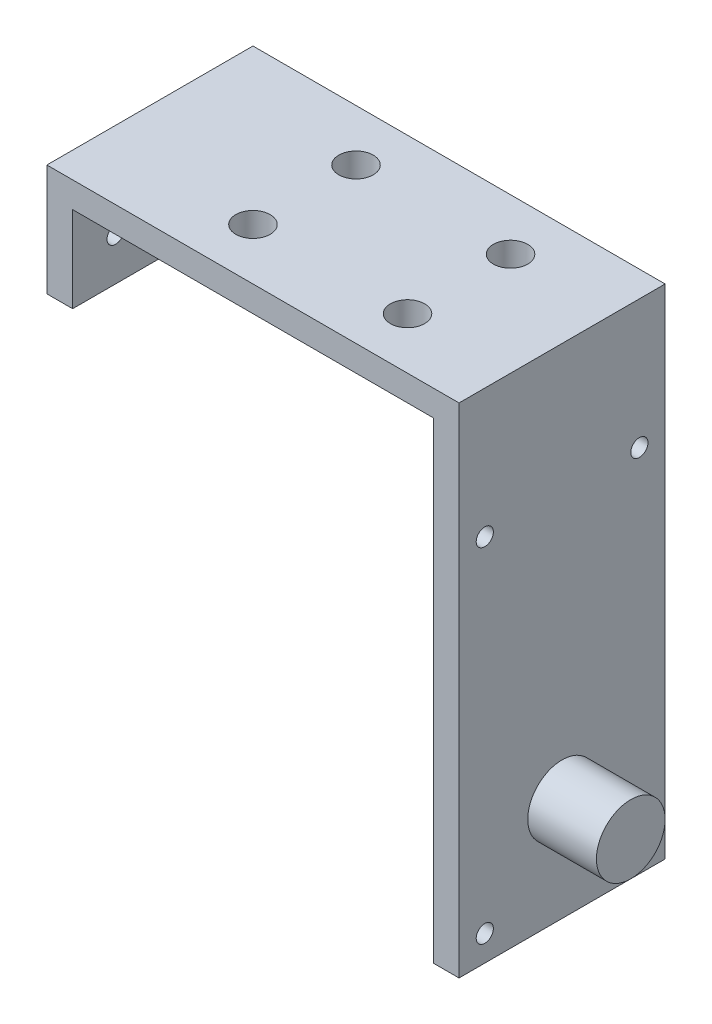
ISO-10303-21;
HEADER;
FILE_DESCRIPTION(('STEP AP214'),'2;1');
FILE_NAME('part.step','',(''),(''),'','','');
FILE_SCHEMA(('AUTOMOTIVE_DESIGN { 1 0 10303 214 1 1 1 1 }'));
ENDSEC;
DATA;
#1=APPLICATION_CONTEXT('core data for automotive mechanical design processes');
#2=APPLICATION_PROTOCOL_DEFINITION('international standard','automotive_design',2000,#1);
#3=PRODUCT_CONTEXT('',#1,'mechanical');
#4=PRODUCT('Part','Part','',(#3));
#5=PRODUCT_RELATED_PRODUCT_CATEGORY('part','',(#4));
#6=PRODUCT_DEFINITION_FORMATION('','',#4);
#7=PRODUCT_DEFINITION_CONTEXT('part definition',#1,'design');
#8=PRODUCT_DEFINITION('design','',#6,#7);
#9=PRODUCT_DEFINITION_SHAPE('','',#8);
#10=(LENGTH_UNIT() NAMED_UNIT(*) SI_UNIT(.MILLI.,.METRE.));
#11=(NAMED_UNIT(*) PLANE_ANGLE_UNIT() SI_UNIT($,.RADIAN.));
#12=(NAMED_UNIT(*) SI_UNIT($,.STERADIAN.) SOLID_ANGLE_UNIT());
#13=UNCERTAINTY_MEASURE_WITH_UNIT(LENGTH_MEASURE(1.E-05),#10,'distance_accuracy_value','');
#14=(GEOMETRIC_REPRESENTATION_CONTEXT(3) GLOBAL_UNCERTAINTY_ASSIGNED_CONTEXT((#13)) GLOBAL_UNIT_ASSIGNED_CONTEXT((#10,
#11,#12)) REPRESENTATION_CONTEXT('',''));
#15=CARTESIAN_POINT('',(0.,0.,0.));
#16=DIRECTION('',(0.,0.,1.));
#17=DIRECTION('',(1.,0.,0.));
#18=AXIS2_PLACEMENT_3D('',#15,#16,#17);
#19=CARTESIAN_POINT('',(0.,0.,12.));
#20=DIRECTION('',(0.,0.,1.));
#21=DIRECTION('',(1.,0.,0.));
#22=AXIS2_PLACEMENT_3D('',#19,#20,#21);
#23=PLANE('',#22);
#24=DIRECTION('',(-1.,0.,0.));
#25=VECTOR('',#24,1.);
#26=CARTESIAN_POINT('',(0.,8.00000000000001,12.));
#27=LINE('',#26,#25);
#28=CARTESIAN_POINT('',(-10.5,8.00000000000001,12.));
#29=VERTEX_POINT('',#28);
#30=CARTESIAN_POINT('',(-12.,8.00000000000001,12.));
#31=VERTEX_POINT('',#30);
#32=EDGE_CURVE('E97',#29,#31,#27,.T.);
#33=ORIENTED_EDGE('',*,*,#32,.F.);
#34=DIRECTION('',(0.,-1.,0.));
#35=VECTOR('',#34,1.);
#36=CARTESIAN_POINT('',(-10.5,13.,12.));
#37=LINE('',#36,#35);
#38=CARTESIAN_POINT('',(-10.5,13.,12.));
#39=VERTEX_POINT('',#38);
#40=EDGE_CURVE('E208',#39,#29,#37,.T.);
#41=ORIENTED_EDGE('',*,*,#40,.F.);
#42=DIRECTION('',(-1.,0.,0.));
#43=VECTOR('',#42,1.);
#44=CARTESIAN_POINT('',(-10.5,13.,12.));
#45=LINE('',#44,#43);
#46=CARTESIAN_POINT('',(10.5,13.,12.));
#47=VERTEX_POINT('',#46);
#48=EDGE_CURVE('E213',#47,#39,#45,.T.);
#49=ORIENTED_EDGE('',*,*,#48,.F.);
#50=DIRECTION('',(0.,1.,0.));
#51=VECTOR('',#50,1.);
#52=CARTESIAN_POINT('',(10.5,13.,12.));
#53=LINE('',#52,#51);
#54=CARTESIAN_POINT('',(10.5,-14.5,12.));
#55=VERTEX_POINT('',#54);
#56=EDGE_CURVE('E210',#55,#47,#53,.T.);
#57=ORIENTED_EDGE('',*,*,#56,.F.);
#58=DIRECTION('',(1.,0.,0.));
#59=VECTOR('',#58,1.);
#60=CARTESIAN_POINT('',(-12.,-14.5,12.));
#61=LINE('',#60,#59);
#62=CARTESIAN_POINT('',(12.,-14.5,12.));
#63=VERTEX_POINT('',#62);
#64=EDGE_CURVE('E119',#55,#63,#61,.T.);
#65=ORIENTED_EDGE('',*,*,#64,.T.);
#66=DIRECTION('',(0.,1.,0.));
#67=VECTOR('',#66,1.);
#68=CARTESIAN_POINT('',(12.,14.5,12.));
#69=LINE('',#68,#67);
#70=CARTESIAN_POINT('',(12.,14.5,12.));
#71=VERTEX_POINT('',#70);
#72=EDGE_CURVE('E123',#63,#71,#69,.T.);
#73=ORIENTED_EDGE('',*,*,#72,.T.);
#74=DIRECTION('',(-1.,0.,0.));
#75=VECTOR('',#74,1.);
#76=CARTESIAN_POINT('',(-12.,14.5,12.));
#77=LINE('',#76,#75);
#78=CARTESIAN_POINT('',(-12.,14.5,12.));
#79=VERTEX_POINT('',#78);
#80=EDGE_CURVE('E117',#71,#79,#77,.T.);
#81=ORIENTED_EDGE('',*,*,#80,.T.);
#82=DIRECTION('',(0.,-1.,0.));
#83=VECTOR('',#82,1.);
#84=CARTESIAN_POINT('',(-12.,14.5,12.));
#85=LINE('',#84,#83);
#86=EDGE_CURVE('E111',#79,#31,#85,.T.);
#87=ORIENTED_EDGE('',*,*,#86,.T.);
#88=EDGE_LOOP('',(#33,#41,#49,#57,#65,#73,#81,#87));
#89=FACE_BOUND('',#88,.T.);
#90=ADVANCED_FACE('F32',(#89),#23,.T.);
#91=CARTESIAN_POINT('',(0.,0.,0.));
#92=DIRECTION('',(0.,0.,1.));
#93=DIRECTION('',(1.,0.,0.));
#94=AXIS2_PLACEMENT_3D('',#91,#92,#93);
#95=PLANE('',#94);
#96=DIRECTION('',(0.,-1.,0.));
#97=VECTOR('',#96,1.);
#98=CARTESIAN_POINT('',(-10.5,13.,0.));
#99=LINE('',#98,#97);
#100=CARTESIAN_POINT('',(-10.5,13.,0.));
#101=VERTEX_POINT('',#100);
#102=CARTESIAN_POINT('',(-10.5,8.00000000000001,0.));
#103=VERTEX_POINT('',#102);
#104=EDGE_CURVE('E207',#101,#103,#99,.T.);
#105=ORIENTED_EDGE('',*,*,#104,.T.);
#106=DIRECTION('',(-1.,0.,0.));
#107=VECTOR('',#106,1.);
#108=CARTESIAN_POINT('',(0.,8.00000000000001,0.));
#109=LINE('',#108,#107);
#110=CARTESIAN_POINT('',(-12.,8.00000000000001,0.));
#111=VERTEX_POINT('',#110);
#112=EDGE_CURVE('E49',#103,#111,#109,.T.);
#113=ORIENTED_EDGE('',*,*,#112,.T.);
#114=DIRECTION('',(0.,-1.,0.));
#115=VECTOR('',#114,1.);
#116=CARTESIAN_POINT('',(-12.,14.5,0.));
#117=LINE('',#116,#115);
#118=CARTESIAN_POINT('',(-12.,14.5,0.));
#119=VERTEX_POINT('',#118);
#120=EDGE_CURVE('E113',#119,#111,#117,.T.);
#121=ORIENTED_EDGE('',*,*,#120,.F.);
#122=DIRECTION('',(-1.,0.,0.));
#123=VECTOR('',#122,1.);
#124=CARTESIAN_POINT('',(-12.,14.5,0.));
#125=LINE('',#124,#123);
#126=CARTESIAN_POINT('',(12.,14.5,0.));
#127=VERTEX_POINT('',#126);
#128=EDGE_CURVE('E130',#127,#119,#125,.T.);
#129=ORIENTED_EDGE('',*,*,#128,.F.);
#130=DIRECTION('',(0.,1.,0.));
#131=VECTOR('',#130,1.);
#132=CARTESIAN_POINT('',(12.,14.5,0.));
#133=LINE('',#132,#131);
#134=CARTESIAN_POINT('',(12.,-14.5,0.));
#135=VERTEX_POINT('',#134);
#136=EDGE_CURVE('E127',#135,#127,#133,.T.);
#137=ORIENTED_EDGE('',*,*,#136,.F.);
#138=DIRECTION('',(1.,0.,0.));
#139=VECTOR('',#138,1.);
#140=CARTESIAN_POINT('',(-12.,-14.5,0.));
#141=LINE('',#140,#139);
#142=CARTESIAN_POINT('',(10.5,-14.5,0.));
#143=VERTEX_POINT('',#142);
#144=EDGE_CURVE('E133',#143,#135,#141,.T.);
#145=ORIENTED_EDGE('',*,*,#144,.F.);
#146=DIRECTION('',(0.,1.,0.));
#147=VECTOR('',#146,1.);
#148=CARTESIAN_POINT('',(10.5,13.,0.));
#149=LINE('',#148,#147);
#150=CARTESIAN_POINT('',(10.5,13.,0.));
#151=VERTEX_POINT('',#150);
#152=EDGE_CURVE('E218',#143,#151,#149,.T.);
#153=ORIENTED_EDGE('',*,*,#152,.T.);
#154=DIRECTION('',(-1.,0.,0.));
#155=VECTOR('',#154,1.);
#156=CARTESIAN_POINT('',(-10.5,13.,0.));
#157=LINE('',#156,#155);
#158=EDGE_CURVE('E211',#151,#101,#157,.T.);
#159=ORIENTED_EDGE('',*,*,#158,.T.);
#160=EDGE_LOOP('',(#105,#113,#121,#129,#137,#145,#153,#159));
#161=FACE_BOUND('',#160,.T.);
#162=ADVANCED_FACE('F234',(#161),#95,.F.);
#163=CARTESIAN_POINT('',(12.,14.5,12.));
#164=DIRECTION('',(-1.,0.,0.));
#165=DIRECTION('',(0.,-1.,0.));
#166=AXIS2_PLACEMENT_3D('',#163,#164,#165);
#167=PLANE('',#166);
#168=CARTESIAN_POINT('',(12.,-8.5,6.));
#169=DIRECTION('',(-1.,0.,0.));
#170=DIRECTION('',(0.,-1.,0.));
#171=AXIS2_PLACEMENT_3D('',#168,#169,#170);
#172=CIRCLE('',#171,2.);
#173=CARTESIAN_POINT('',(12.,-10.5,6.));
#174=VERTEX_POINT('',#173);
#175=EDGE_CURVE('E11',#174,#174,#172,.F.);
#176=ORIENTED_EDGE('',*,*,#175,.F.);
#177=EDGE_LOOP('',(#176));
#178=FACE_BOUND('',#177,.T.);
#179=CARTESIAN_POINT('',(12.,-13.,1.5));
#180=DIRECTION('',(1.,0.,0.));
#181=DIRECTION('',(0.,-1.,0.));
#182=AXIS2_PLACEMENT_3D('',#179,#180,#181);
#183=CIRCLE('',#182,0.500000000000001);
#184=CARTESIAN_POINT('',(12.,-13.5,1.5));
#185=VERTEX_POINT('',#184);
#186=EDGE_CURVE('E150',#185,#185,#183,.T.);
#187=ORIENTED_EDGE('',*,*,#186,.F.);
#188=EDGE_LOOP('',(#187));
#189=FACE_BOUND('',#188,.T.);
#190=CARTESIAN_POINT('',(12.,7.,10.5));
#191=DIRECTION('',(1.,0.,0.));
#192=DIRECTION('',(0.,1.,0.));
#193=AXIS2_PLACEMENT_3D('',#190,#191,#192);
#194=CIRCLE('',#193,0.500000000000001);
#195=CARTESIAN_POINT('',(12.,7.5,10.5));
#196=VERTEX_POINT('',#195);
#197=EDGE_CURVE('E196',#196,#196,#194,.T.);
#198=ORIENTED_EDGE('',*,*,#197,.F.);
#199=EDGE_LOOP('',(#198));
#200=FACE_BOUND('',#199,.T.);
#201=CARTESIAN_POINT('',(12.,7.,1.5));
#202=DIRECTION('',(1.,0.,0.));
#203=DIRECTION('',(0.,-1.,0.));
#204=AXIS2_PLACEMENT_3D('',#201,#202,#203);
#205=CIRCLE('',#204,0.500000000000001);
#206=CARTESIAN_POINT('',(12.,6.5,1.5));
#207=VERTEX_POINT('',#206);
#208=EDGE_CURVE('E159',#207,#207,#205,.T.);
#209=ORIENTED_EDGE('',*,*,#208,.F.);
#210=EDGE_LOOP('',(#209));
#211=FACE_BOUND('',#210,.T.);
#212=CARTESIAN_POINT('',(12.,-13.,10.5));
#213=DIRECTION('',(1.,0.,0.));
#214=DIRECTION('',(0.,1.,0.));
#215=AXIS2_PLACEMENT_3D('',#212,#213,#214);
#216=CIRCLE('',#215,0.500000000000001);
#217=CARTESIAN_POINT('',(12.,-12.5,10.5));
#218=VERTEX_POINT('',#217);
#219=EDGE_CURVE('E145',#218,#218,#216,.T.);
#220=ORIENTED_EDGE('',*,*,#219,.F.);
#221=EDGE_LOOP('',(#220));
#222=FACE_BOUND('',#221,.T.);
#223=ORIENTED_EDGE('',*,*,#136,.T.);
#224=DIRECTION('',(0.,0.,-1.));
#225=VECTOR('',#224,1.);
#226=CARTESIAN_POINT('',(12.,14.5,12.));
#227=LINE('',#226,#225);
#228=EDGE_CURVE('E139',#71,#127,#227,.T.);
#229=ORIENTED_EDGE('',*,*,#228,.F.);
#230=ORIENTED_EDGE('',*,*,#72,.F.);
#231=DIRECTION('',(0.,0.,-1.));
#232=VECTOR('',#231,1.);
#233=CARTESIAN_POINT('',(12.,-14.5,12.));
#234=LINE('',#233,#232);
#235=EDGE_CURVE('E121',#63,#135,#234,.T.);
#236=ORIENTED_EDGE('',*,*,#235,.T.);
#237=EDGE_LOOP('',(#223,#229,#230,#236));
#238=FACE_BOUND('',#237,.T.);
#239=ADVANCED_FACE('F34',(#178,#189,#200,#211,#222,#238),#167,.F.);
#240=CARTESIAN_POINT('',(-12.,14.5,12.));
#241=DIRECTION('',(0.,-1.,0.));
#242=DIRECTION('',(0.,0.,-1.));
#243=AXIS2_PLACEMENT_3D('',#240,#241,#242);
#244=PLANE('',#243);
#245=CARTESIAN_POINT('',(6.,14.5,9.));
#246=DIRECTION('',(0.,1.,0.));
#247=DIRECTION('',(0.,0.,-1.));
#248=AXIS2_PLACEMENT_3D('',#245,#246,#247);
#249=CIRCLE('',#248,0.999999999999999);
#250=CARTESIAN_POINT('',(6.,14.5,8.));
#251=VERTEX_POINT('',#250);
#252=EDGE_CURVE('E173',#251,#251,#249,.T.);
#253=ORIENTED_EDGE('',*,*,#252,.F.);
#254=EDGE_LOOP('',(#253));
#255=FACE_BOUND('',#254,.T.);
#256=CARTESIAN_POINT('',(-3.,14.5,3.));
#257=DIRECTION('',(0.,1.,0.));
#258=DIRECTION('',(0.,0.,1.));
#259=AXIS2_PLACEMENT_3D('',#256,#257,#258);
#260=CIRCLE('',#259,1.);
#261=CARTESIAN_POINT('',(-3.,14.5,4.));
#262=VERTEX_POINT('',#261);
#263=EDGE_CURVE('E322',#262,#262,#260,.T.);
#264=ORIENTED_EDGE('',*,*,#263,.F.);
#265=EDGE_LOOP('',(#264));
#266=FACE_BOUND('',#265,.T.);
#267=CARTESIAN_POINT('',(-3.,14.5,9.));
#268=DIRECTION('',(0.,1.,0.));
#269=DIRECTION('',(0.,0.,-1.));
#270=AXIS2_PLACEMENT_3D('',#267,#268,#269);
#271=CIRCLE('',#270,0.999999999999999);
#272=CARTESIAN_POINT('',(-3.,14.5,8.));
#273=VERTEX_POINT('',#272);
#274=EDGE_CURVE('E186',#273,#273,#271,.T.);
#275=ORIENTED_EDGE('',*,*,#274,.F.);
#276=EDGE_LOOP('',(#275));
#277=FACE_BOUND('',#276,.T.);
#278=CARTESIAN_POINT('',(6.,14.5,3.));
#279=DIRECTION('',(0.,1.,0.));
#280=DIRECTION('',(0.,0.,1.));
#281=AXIS2_PLACEMENT_3D('',#278,#279,#280);
#282=CIRCLE('',#281,1.);
#283=CARTESIAN_POINT('',(6.,14.5,4.));
#284=VERTEX_POINT('',#283);
#285=EDGE_CURVE('E169',#284,#284,#282,.T.);
#286=ORIENTED_EDGE('',*,*,#285,.F.);
#287=EDGE_LOOP('',(#286));
#288=FACE_BOUND('',#287,.T.);
#289=ORIENTED_EDGE('',*,*,#128,.T.);
#290=DIRECTION('',(0.,0.,-1.));
#291=VECTOR('',#290,1.);
#292=CARTESIAN_POINT('',(-12.,14.5,12.));
#293=LINE('',#292,#291);
#294=EDGE_CURVE('E137',#79,#119,#293,.T.);
#295=ORIENTED_EDGE('',*,*,#294,.F.);
#296=ORIENTED_EDGE('',*,*,#80,.F.);
#297=ORIENTED_EDGE('',*,*,#228,.T.);
#298=EDGE_LOOP('',(#289,#295,#296,#297));
#299=FACE_BOUND('',#298,.T.);
#300=ADVANCED_FACE('F232',(#255,#266,#277,#288,#299),#244,.F.);
#301=CARTESIAN_POINT('',(-12.,14.5,12.));
#302=DIRECTION('',(1.,0.,0.));
#303=DIRECTION('',(0.,1.,0.));
#304=AXIS2_PLACEMENT_3D('',#301,#302,#303);
#305=PLANE('',#304);
#306=CARTESIAN_POINT('',(-12.,10.5,2.5));
#307=DIRECTION('',(-1.,0.,0.));
#308=DIRECTION('',(0.,1.,0.));
#309=AXIS2_PLACEMENT_3D('',#306,#307,#308);
#310=CIRCLE('',#309,0.500000000000001);
#311=CARTESIAN_POINT('',(-12.,11.,2.5));
#312=VERTEX_POINT('',#311);
#313=EDGE_CURVE('E163',#312,#312,#310,.T.);
#314=ORIENTED_EDGE('',*,*,#313,.F.);
#315=EDGE_LOOP('',(#314));
#316=FACE_BOUND('',#315,.T.);
#317=CARTESIAN_POINT('',(-12.,10.5,9.5));
#318=DIRECTION('',(-1.,0.,0.));
#319=DIRECTION('',(0.,-1.,0.));
#320=AXIS2_PLACEMENT_3D('',#317,#318,#319);
#321=CIRCLE('',#320,0.500000000000001);
#322=CARTESIAN_POINT('',(-12.,10.,9.5));
#323=VERTEX_POINT('',#322);
#324=EDGE_CURVE('E160',#323,#323,#321,.T.);
#325=ORIENTED_EDGE('',*,*,#324,.F.);
#326=EDGE_LOOP('',(#325));
#327=FACE_BOUND('',#326,.T.);
#328=ORIENTED_EDGE('',*,*,#120,.T.);
#329=DIRECTION('',(0.,0.,-1.));
#330=VECTOR('',#329,1.);
#331=CARTESIAN_POINT('',(-12.,8.00000000000001,0.));
#332=LINE('',#331,#330);
#333=EDGE_CURVE('E100',#31,#111,#332,.T.);
#334=ORIENTED_EDGE('',*,*,#333,.F.);
#335=ORIENTED_EDGE('',*,*,#86,.F.);
#336=ORIENTED_EDGE('',*,*,#294,.T.);
#337=EDGE_LOOP('',(#328,#334,#335,#336));
#338=FACE_BOUND('',#337,.T.);
#339=ADVANCED_FACE('F109',(#316,#327,#338),#305,.F.);
#340=CARTESIAN_POINT('',(-12.,-14.5,12.));
#341=DIRECTION('',(0.,1.,0.));
#342=DIRECTION('',(0.,0.,1.));
#343=AXIS2_PLACEMENT_3D('',#340,#341,#342);
#344=PLANE('',#343);
#345=ORIENTED_EDGE('',*,*,#64,.F.);
#346=DIRECTION('',(0.,0.,-1.));
#347=VECTOR('',#346,1.);
#348=CARTESIAN_POINT('',(10.5,-14.5,0.));
#349=LINE('',#348,#347);
#350=EDGE_CURVE('E203',#55,#143,#349,.T.);
#351=ORIENTED_EDGE('',*,*,#350,.T.);
#352=ORIENTED_EDGE('',*,*,#144,.T.);
#353=ORIENTED_EDGE('',*,*,#235,.F.);
#354=EDGE_LOOP('',(#345,#351,#352,#353));
#355=FACE_BOUND('',#354,.T.);
#356=ADVANCED_FACE('F245',(#355),#344,.F.);
#357=CARTESIAN_POINT('',(-10.5,13.,12.));
#358=DIRECTION('',(1.,0.,0.));
#359=DIRECTION('',(0.,1.,0.));
#360=AXIS2_PLACEMENT_3D('',#357,#358,#359);
#361=PLANE('',#360);
#362=CARTESIAN_POINT('',(-10.5,10.5,2.5));
#363=DIRECTION('',(1.,0.,0.));
#364=DIRECTION('',(0.,1.,0.));
#365=AXIS2_PLACEMENT_3D('',#362,#363,#364);
#366=CIRCLE('',#365,0.500000000000001);
#367=CARTESIAN_POINT('',(-10.5,11.,2.5));
#368=VERTEX_POINT('',#367);
#369=EDGE_CURVE('E161',#368,#368,#366,.T.);
#370=ORIENTED_EDGE('',*,*,#369,.F.);
#371=EDGE_LOOP('',(#370));
#372=FACE_BOUND('',#371,.T.);
#373=CARTESIAN_POINT('',(-10.5,10.5,9.5));
#374=DIRECTION('',(1.,0.,0.));
#375=DIRECTION('',(0.,1.,0.));
#376=AXIS2_PLACEMENT_3D('',#373,#374,#375);
#377=CIRCLE('',#376,0.500000000000001);
#378=CARTESIAN_POINT('',(-10.5,11.,9.5));
#379=VERTEX_POINT('',#378);
#380=EDGE_CURVE('E156',#379,#379,#377,.T.);
#381=ORIENTED_EDGE('',*,*,#380,.F.);
#382=EDGE_LOOP('',(#381));
#383=FACE_BOUND('',#382,.T.);
#384=DIRECTION('',(0.,0.,1.));
#385=VECTOR('',#384,1.);
#386=CARTESIAN_POINT('',(-10.5,8.00000000000001,12.));
#387=LINE('',#386,#385);
#388=EDGE_CURVE('E41',#103,#29,#387,.T.);
#389=ORIENTED_EDGE('',*,*,#388,.F.);
#390=ORIENTED_EDGE('',*,*,#104,.F.);
#391=DIRECTION('',(0.,0.,-1.));
#392=VECTOR('',#391,1.);
#393=CARTESIAN_POINT('',(-10.5,13.,12.));
#394=LINE('',#393,#392);
#395=EDGE_CURVE('E215',#39,#101,#394,.T.);
#396=ORIENTED_EDGE('',*,*,#395,.F.);
#397=ORIENTED_EDGE('',*,*,#40,.T.);
#398=EDGE_LOOP('',(#389,#390,#396,#397));
#399=FACE_BOUND('',#398,.T.);
#400=ADVANCED_FACE('F237',(#372,#383,#399),#361,.T.);
#401=CARTESIAN_POINT('',(10.5,13.,12.));
#402=DIRECTION('',(-1.,0.,0.));
#403=DIRECTION('',(0.,-1.,0.));
#404=AXIS2_PLACEMENT_3D('',#401,#402,#403);
#405=PLANE('',#404);
#406=CARTESIAN_POINT('',(10.5,-13.,1.5));
#407=DIRECTION('',(-1.,0.,0.));
#408=DIRECTION('',(0.,-1.,0.));
#409=AXIS2_PLACEMENT_3D('',#406,#407,#408);
#410=CIRCLE('',#409,0.500000000000001);
#411=CARTESIAN_POINT('',(10.5,-13.5,1.5));
#412=VERTEX_POINT('',#411);
#413=EDGE_CURVE('E153',#412,#412,#410,.T.);
#414=ORIENTED_EDGE('',*,*,#413,.F.);
#415=EDGE_LOOP('',(#414));
#416=FACE_BOUND('',#415,.T.);
#417=CARTESIAN_POINT('',(10.5,7.,10.5));
#418=DIRECTION('',(-1.,0.,0.));
#419=DIRECTION('',(0.,-1.,0.));
#420=AXIS2_PLACEMENT_3D('',#417,#418,#419);
#421=CIRCLE('',#420,0.500000000000001);
#422=CARTESIAN_POINT('',(10.5,6.5,10.5));
#423=VERTEX_POINT('',#422);
#424=EDGE_CURVE('E149',#423,#423,#421,.T.);
#425=ORIENTED_EDGE('',*,*,#424,.F.);
#426=EDGE_LOOP('',(#425));
#427=FACE_BOUND('',#426,.T.);
#428=CARTESIAN_POINT('',(10.5,7.,1.5));
#429=DIRECTION('',(-1.,0.,0.));
#430=DIRECTION('',(0.,-1.,0.));
#431=AXIS2_PLACEMENT_3D('',#428,#429,#430);
#432=CIRCLE('',#431,0.500000000000001);
#433=CARTESIAN_POINT('',(10.5,6.5,1.5));
#434=VERTEX_POINT('',#433);
#435=EDGE_CURVE('E146',#434,#434,#432,.T.);
#436=ORIENTED_EDGE('',*,*,#435,.F.);
#437=EDGE_LOOP('',(#436));
#438=FACE_BOUND('',#437,.T.);
#439=CARTESIAN_POINT('',(10.5,-13.,10.5));
#440=DIRECTION('',(-1.,0.,0.));
#441=DIRECTION('',(0.,-1.,0.));
#442=AXIS2_PLACEMENT_3D('',#439,#440,#441);
#443=CIRCLE('',#442,0.500000000000001);
#444=CARTESIAN_POINT('',(10.5,-13.5,10.5));
#445=VERTEX_POINT('',#444);
#446=EDGE_CURVE('E114',#445,#445,#443,.T.);
#447=ORIENTED_EDGE('',*,*,#446,.F.);
#448=EDGE_LOOP('',(#447));
#449=FACE_BOUND('',#448,.T.);
#450=ORIENTED_EDGE('',*,*,#152,.F.);
#451=ORIENTED_EDGE('',*,*,#350,.F.);
#452=ORIENTED_EDGE('',*,*,#56,.T.);
#453=DIRECTION('',(0.,0.,-1.));
#454=VECTOR('',#453,1.);
#455=CARTESIAN_POINT('',(10.5,13.,12.));
#456=LINE('',#455,#454);
#457=EDGE_CURVE('E57',#47,#151,#456,.T.);
#458=ORIENTED_EDGE('',*,*,#457,.T.);
#459=EDGE_LOOP('',(#450,#451,#452,#458));
#460=FACE_BOUND('',#459,.T.);
#461=ADVANCED_FACE('F242',(#416,#427,#438,#449,#460),#405,.T.);
#462=CARTESIAN_POINT('',(-10.5,13.,12.));
#463=DIRECTION('',(0.,-1.,0.));
#464=DIRECTION('',(0.,0.,-1.));
#465=AXIS2_PLACEMENT_3D('',#462,#463,#464);
#466=PLANE('',#465);
#467=CARTESIAN_POINT('',(6.,13.,9.));
#468=DIRECTION('',(0.,-1.,0.));
#469=DIRECTION('',(0.,0.,-1.));
#470=AXIS2_PLACEMENT_3D('',#467,#468,#469);
#471=CIRCLE('',#470,0.999999999999999);
#472=CARTESIAN_POINT('',(6.,13.,8.));
#473=VERTEX_POINT('',#472);
#474=EDGE_CURVE('E36',#473,#473,#471,.T.);
#475=ORIENTED_EDGE('',*,*,#474,.F.);
#476=EDGE_LOOP('',(#475));
#477=FACE_BOUND('',#476,.T.);
#478=CARTESIAN_POINT('',(-3.,13.,3.));
#479=DIRECTION('',(0.,-1.,0.));
#480=DIRECTION('',(0.,0.,-1.));
#481=AXIS2_PLACEMENT_3D('',#478,#479,#480);
#482=CIRCLE('',#481,1.);
#483=CARTESIAN_POINT('',(-3.,13.,2.));
#484=VERTEX_POINT('',#483);
#485=EDGE_CURVE('E172',#484,#484,#482,.T.);
#486=ORIENTED_EDGE('',*,*,#485,.F.);
#487=EDGE_LOOP('',(#486));
#488=FACE_BOUND('',#487,.T.);
#489=CARTESIAN_POINT('',(-3.,13.,9.));
#490=DIRECTION('',(0.,-1.,0.));
#491=DIRECTION('',(0.,0.,-1.));
#492=AXIS2_PLACEMENT_3D('',#489,#490,#491);
#493=CIRCLE('',#492,0.999999999999999);
#494=CARTESIAN_POINT('',(-3.,13.,8.));
#495=VERTEX_POINT('',#494);
#496=EDGE_CURVE('E170',#495,#495,#493,.T.);
#497=ORIENTED_EDGE('',*,*,#496,.F.);
#498=EDGE_LOOP('',(#497));
#499=FACE_BOUND('',#498,.T.);
#500=CARTESIAN_POINT('',(6.,13.,3.));
#501=DIRECTION('',(0.,-1.,0.));
#502=DIRECTION('',(0.,0.,-1.));
#503=AXIS2_PLACEMENT_3D('',#500,#501,#502);
#504=CIRCLE('',#503,1.);
#505=CARTESIAN_POINT('',(6.,13.,2.));
#506=VERTEX_POINT('',#505);
#507=EDGE_CURVE('E165',#506,#506,#504,.T.);
#508=ORIENTED_EDGE('',*,*,#507,.F.);
#509=EDGE_LOOP('',(#508));
#510=FACE_BOUND('',#509,.T.);
#511=ORIENTED_EDGE('',*,*,#158,.F.);
#512=ORIENTED_EDGE('',*,*,#457,.F.);
#513=ORIENTED_EDGE('',*,*,#48,.T.);
#514=ORIENTED_EDGE('',*,*,#395,.T.);
#515=EDGE_LOOP('',(#511,#512,#513,#514));
#516=FACE_BOUND('',#515,.T.);
#517=ADVANCED_FACE('F238',(#477,#488,#499,#510,#516),#466,.T.);
#518=CARTESIAN_POINT('',(0.,8.00000000000001,0.));
#519=DIRECTION('',(0.,1.,0.));
#520=DIRECTION('',(-1.,0.,0.));
#521=AXIS2_PLACEMENT_3D('',#518,#519,#520);
#522=PLANE('',#521);
#523=ORIENTED_EDGE('',*,*,#388,.T.);
#524=ORIENTED_EDGE('',*,*,#32,.T.);
#525=ORIENTED_EDGE('',*,*,#333,.T.);
#526=ORIENTED_EDGE('',*,*,#112,.F.);
#527=EDGE_LOOP('',(#523,#524,#525,#526));
#528=FACE_BOUND('',#527,.T.);
#529=ADVANCED_FACE('F99',(#528),#522,.F.);
#530=CARTESIAN_POINT('',(0.,-13.,10.5));
#531=DIRECTION('',(1.,0.,0.));
#532=DIRECTION('',(0.,1.,0.));
#533=AXIS2_PLACEMENT_3D('',#530,#531,#532);
#534=CYLINDRICAL_SURFACE('',#533,0.500000000000001);
#535=ORIENTED_EDGE('',*,*,#446,.T.);
#536=EDGE_LOOP('',(#535));
#537=FACE_BOUND('',#536,.T.);
#538=ORIENTED_EDGE('',*,*,#219,.T.);
#539=EDGE_LOOP('',(#538));
#540=FACE_BOUND('',#539,.T.);
#541=ADVANCED_FACE('F271',(#537,#540),#534,.F.);
#542=CARTESIAN_POINT('',(0.,7.,1.5));
#543=DIRECTION('',(1.,0.,0.));
#544=DIRECTION('',(0.,1.,0.));
#545=AXIS2_PLACEMENT_3D('',#542,#543,#544);
#546=CYLINDRICAL_SURFACE('',#545,0.500000000000001);
#547=ORIENTED_EDGE('',*,*,#435,.T.);
#548=EDGE_LOOP('',(#547));
#549=FACE_BOUND('',#548,.T.);
#550=ORIENTED_EDGE('',*,*,#208,.T.);
#551=EDGE_LOOP('',(#550));
#552=FACE_BOUND('',#551,.T.);
#553=ADVANCED_FACE('F274',(#549,#552),#546,.F.);
#554=CARTESIAN_POINT('',(0.,7.,10.5));
#555=DIRECTION('',(1.,0.,0.));
#556=DIRECTION('',(0.,1.,0.));
#557=AXIS2_PLACEMENT_3D('',#554,#555,#556);
#558=CYLINDRICAL_SURFACE('',#557,0.500000000000001);
#559=ORIENTED_EDGE('',*,*,#424,.T.);
#560=EDGE_LOOP('',(#559));
#561=FACE_BOUND('',#560,.T.);
#562=ORIENTED_EDGE('',*,*,#197,.T.);
#563=EDGE_LOOP('',(#562));
#564=FACE_BOUND('',#563,.T.);
#565=ADVANCED_FACE('F278',(#561,#564),#558,.F.);
#566=CARTESIAN_POINT('',(0.,-13.,1.5));
#567=DIRECTION('',(1.,0.,0.));
#568=DIRECTION('',(0.,1.,0.));
#569=AXIS2_PLACEMENT_3D('',#566,#567,#568);
#570=CYLINDRICAL_SURFACE('',#569,0.500000000000001);
#571=ORIENTED_EDGE('',*,*,#413,.T.);
#572=EDGE_LOOP('',(#571));
#573=FACE_BOUND('',#572,.T.);
#574=ORIENTED_EDGE('',*,*,#186,.T.);
#575=EDGE_LOOP('',(#574));
#576=FACE_BOUND('',#575,.T.);
#577=ADVANCED_FACE('F282',(#573,#576),#570,.F.);
#578=CARTESIAN_POINT('',(0.,10.5,9.5));
#579=DIRECTION('',(-1.,0.,0.));
#580=DIRECTION('',(0.,-1.,0.));
#581=AXIS2_PLACEMENT_3D('',#578,#579,#580);
#582=CYLINDRICAL_SURFACE('',#581,0.500000000000001);
#583=ORIENTED_EDGE('',*,*,#380,.T.);
#584=EDGE_LOOP('',(#583));
#585=FACE_BOUND('',#584,.T.);
#586=ORIENTED_EDGE('',*,*,#324,.T.);
#587=EDGE_LOOP('',(#586));
#588=FACE_BOUND('',#587,.T.);
#589=ADVANCED_FACE('F286',(#585,#588),#582,.F.);
#590=CARTESIAN_POINT('',(0.,10.5,2.5));
#591=DIRECTION('',(-1.,0.,0.));
#592=DIRECTION('',(0.,-1.,0.));
#593=AXIS2_PLACEMENT_3D('',#590,#591,#592);
#594=CYLINDRICAL_SURFACE('',#593,0.500000000000001);
#595=ORIENTED_EDGE('',*,*,#369,.T.);
#596=EDGE_LOOP('',(#595));
#597=FACE_BOUND('',#596,.T.);
#598=ORIENTED_EDGE('',*,*,#313,.T.);
#599=EDGE_LOOP('',(#598));
#600=FACE_BOUND('',#599,.T.);
#601=ADVANCED_FACE('F290',(#597,#600),#594,.F.);
#602=CARTESIAN_POINT('',(16.,-8.5,6.));
#603=DIRECTION('',(-1.,0.,0.));
#604=DIRECTION('',(0.,-1.,0.));
#605=AXIS2_PLACEMENT_3D('',#602,#603,#604);
#606=CYLINDRICAL_SURFACE('',#605,2.);
#607=CARTESIAN_POINT('',(16.,-8.5,6.));
#608=DIRECTION('',(1.,0.,0.));
#609=DIRECTION('',(0.,1.,0.));
#610=AXIS2_PLACEMENT_3D('',#607,#608,#609);
#611=CIRCLE('',#610,2.);
#612=CARTESIAN_POINT('',(16.,-6.5,6.));
#613=VERTEX_POINT('',#612);
#614=EDGE_CURVE('E168',#613,#613,#611,.T.);
#615=ORIENTED_EDGE('',*,*,#614,.F.);
#616=EDGE_LOOP('',(#615));
#617=FACE_BOUND('',#616,.T.);
#618=ORIENTED_EDGE('',*,*,#175,.T.);
#619=EDGE_LOOP('',(#618));
#620=FACE_BOUND('',#619,.T.);
#621=ADVANCED_FACE('F294',(#617,#620),#606,.T.);
#622=CARTESIAN_POINT('',(16.,-8.5,6.));
#623=DIRECTION('',(1.,0.,0.));
#624=DIRECTION('',(0.,1.,0.));
#625=AXIS2_PLACEMENT_3D('',#622,#623,#624);
#626=PLANE('',#625);
#627=ORIENTED_EDGE('',*,*,#614,.T.);
#628=EDGE_LOOP('',(#627));
#629=FACE_BOUND('',#628,.T.);
#630=ADVANCED_FACE('F298',(#629),#626,.T.);
#631=CARTESIAN_POINT('',(6.,4.5,3.));
#632=DIRECTION('',(0.,1.,0.));
#633=DIRECTION('',(0.,0.,1.));
#634=AXIS2_PLACEMENT_3D('',#631,#632,#633);
#635=CYLINDRICAL_SURFACE('',#634,1.);
#636=ORIENTED_EDGE('',*,*,#507,.T.);
#637=EDGE_LOOP('',(#636));
#638=FACE_BOUND('',#637,.T.);
#639=ORIENTED_EDGE('',*,*,#285,.T.);
#640=EDGE_LOOP('',(#639));
#641=FACE_BOUND('',#640,.T.);
#642=ADVANCED_FACE('F302',(#638,#641),#635,.F.);
#643=CARTESIAN_POINT('',(-3.,4.5,9.));
#644=DIRECTION('',(0.,1.,0.));
#645=DIRECTION('',(0.,0.,1.));
#646=AXIS2_PLACEMENT_3D('',#643,#644,#645);
#647=CYLINDRICAL_SURFACE('',#646,0.999999999999999);
#648=ORIENTED_EDGE('',*,*,#496,.T.);
#649=EDGE_LOOP('',(#648));
#650=FACE_BOUND('',#649,.T.);
#651=ORIENTED_EDGE('',*,*,#274,.T.);
#652=EDGE_LOOP('',(#651));
#653=FACE_BOUND('',#652,.T.);
#654=ADVANCED_FACE('F306',(#650,#653),#647,.F.);
#655=CARTESIAN_POINT('',(-3.,4.5,3.));
#656=DIRECTION('',(0.,1.,0.));
#657=DIRECTION('',(0.,0.,1.));
#658=AXIS2_PLACEMENT_3D('',#655,#656,#657);
#659=CYLINDRICAL_SURFACE('',#658,1.);
#660=ORIENTED_EDGE('',*,*,#485,.T.);
#661=EDGE_LOOP('',(#660));
#662=FACE_BOUND('',#661,.T.);
#663=ORIENTED_EDGE('',*,*,#263,.T.);
#664=EDGE_LOOP('',(#663));
#665=FACE_BOUND('',#664,.T.);
#666=ADVANCED_FACE('F310',(#662,#665),#659,.F.);
#667=CARTESIAN_POINT('',(6.,4.5,9.));
#668=DIRECTION('',(0.,1.,0.));
#669=DIRECTION('',(0.,0.,1.));
#670=AXIS2_PLACEMENT_3D('',#667,#668,#669);
#671=CYLINDRICAL_SURFACE('',#670,0.999999999999999);
#672=ORIENTED_EDGE('',*,*,#474,.T.);
#673=EDGE_LOOP('',(#672));
#674=FACE_BOUND('',#673,.T.);
#675=ORIENTED_EDGE('',*,*,#252,.T.);
#676=EDGE_LOOP('',(#675));
#677=FACE_BOUND('',#676,.T.);
#678=ADVANCED_FACE('F314',(#674,#677),#671,.F.);
#679=CLOSED_SHELL('',(#90,#162,#239,#300,#339,#356,#400,#461,#517,#529,#541,#553,#565,#577,#589,
#601,#621,#630,#642,#654,#666,#678));
#680=MANIFOLD_SOLID_BREP('B2',#679);
#681=ADVANCED_BREP_SHAPE_REPRESENTATION('',(#18,#680),#14);
#682=SHAPE_DEFINITION_REPRESENTATION(#9,#681);
ENDSEC;
END-ISO-10303-21;
